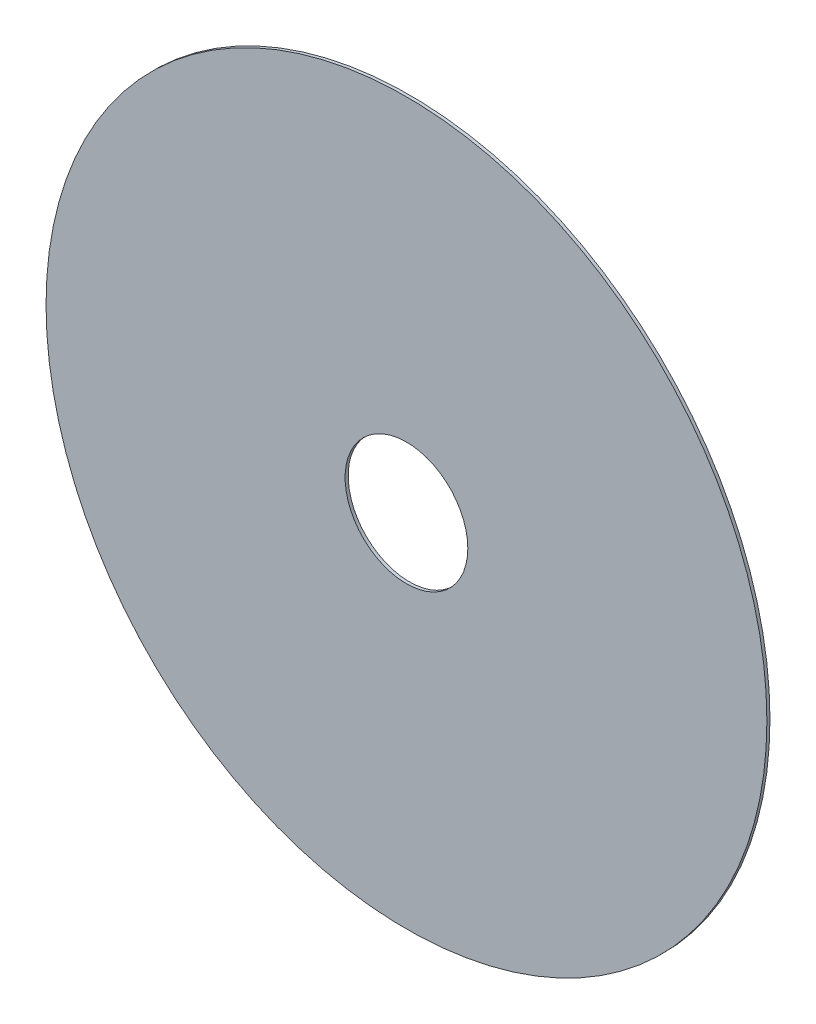
ISO-10303-21;
HEADER;
FILE_DESCRIPTION(('STEP AP214'),'2;1');
FILE_NAME('part.step','',(''),(''),'','','');
FILE_SCHEMA(('AUTOMOTIVE_DESIGN { 1 0 10303 214 1 1 1 1 }'));
ENDSEC;
DATA;
#1=APPLICATION_CONTEXT('core data for automotive mechanical design processes');
#2=APPLICATION_PROTOCOL_DEFINITION('international standard','automotive_design',2000,#1);
#3=PRODUCT_CONTEXT('',#1,'mechanical');
#4=PRODUCT('Part','Part','',(#3));
#5=PRODUCT_RELATED_PRODUCT_CATEGORY('part','',(#4));
#6=PRODUCT_DEFINITION_FORMATION('','',#4);
#7=PRODUCT_DEFINITION_CONTEXT('part definition',#1,'design');
#8=PRODUCT_DEFINITION('design','',#6,#7);
#9=PRODUCT_DEFINITION_SHAPE('','',#8);
#10=(LENGTH_UNIT() NAMED_UNIT(*) SI_UNIT(.MILLI.,.METRE.));
#11=(NAMED_UNIT(*) PLANE_ANGLE_UNIT() SI_UNIT($,.RADIAN.));
#12=(NAMED_UNIT(*) SI_UNIT($,.STERADIAN.) SOLID_ANGLE_UNIT());
#13=UNCERTAINTY_MEASURE_WITH_UNIT(LENGTH_MEASURE(1.E-05),#10,'distance_accuracy_value','');
#14=(GEOMETRIC_REPRESENTATION_CONTEXT(3) GLOBAL_UNCERTAINTY_ASSIGNED_CONTEXT((#13)) GLOBAL_UNIT_ASSIGNED_CONTEXT((#10,
#11,#12)) REPRESENTATION_CONTEXT('',''));
#15=CARTESIAN_POINT('',(0.,0.,0.));
#16=DIRECTION('',(0.,0.,1.));
#17=DIRECTION('',(1.,0.,0.));
#18=AXIS2_PLACEMENT_3D('',#15,#16,#17);
#19=CARTESIAN_POINT('',(0.,0.,0.254));
#20=DIRECTION('',(0.,0.,-1.));
#21=DIRECTION('',(-1.,0.,0.));
#22=AXIS2_PLACEMENT_3D('',#19,#20,#21);
#23=CYLINDRICAL_SURFACE('',#22,29.845);
#24=CARTESIAN_POINT('',(0.,0.,0.254));
#25=DIRECTION('',(0.,0.,1.));
#26=DIRECTION('',(1.,0.,0.));
#27=AXIS2_PLACEMENT_3D('',#24,#25,#26);
#28=CIRCLE('',#27,29.845);
#29=CARTESIAN_POINT('',(29.845,0.,0.254));
#30=VERTEX_POINT('',#29);
#31=EDGE_CURVE('E10',#30,#30,#28,.T.);
#32=ORIENTED_EDGE('',*,*,#31,.F.);
#33=EDGE_LOOP('',(#32));
#34=FACE_BOUND('',#33,.T.);
#35=CARTESIAN_POINT('',(0.,0.,0.));
#36=DIRECTION('',(0.,0.,1.));
#37=DIRECTION('',(1.,0.,0.));
#38=AXIS2_PLACEMENT_3D('',#35,#36,#37);
#39=CIRCLE('',#38,29.845);
#40=CARTESIAN_POINT('',(29.845,0.,0.));
#41=VERTEX_POINT('',#40);
#42=EDGE_CURVE('E40',#41,#41,#39,.T.);
#43=ORIENTED_EDGE('',*,*,#42,.T.);
#44=EDGE_LOOP('',(#43));
#45=FACE_BOUND('',#44,.T.);
#46=ADVANCED_FACE('F37',(#34,#45),#23,.T.);
#47=CARTESIAN_POINT('',(0.,0.,0.254));
#48=DIRECTION('',(0.,0.,1.));
#49=DIRECTION('',(1.,0.,0.));
#50=AXIS2_PLACEMENT_3D('',#47,#48,#49);
#51=PLANE('',#50);
#52=CARTESIAN_POINT('',(0.,0.,0.254));
#53=DIRECTION('',(0.,0.,1.));
#54=DIRECTION('',(1.,0.,0.));
#55=AXIS2_PLACEMENT_3D('',#52,#53,#54);
#56=CIRCLE('',#55,5.08);
#57=CARTESIAN_POINT('',(5.08,0.,0.254));
#58=VERTEX_POINT('',#57);
#59=EDGE_CURVE('E54',#58,#58,#56,.T.);
#60=ORIENTED_EDGE('',*,*,#59,.F.);
#61=EDGE_LOOP('',(#60));
#62=FACE_BOUND('',#61,.T.);
#63=ORIENTED_EDGE('',*,*,#31,.T.);
#64=EDGE_LOOP('',(#63));
#65=FACE_BOUND('',#64,.T.);
#66=ADVANCED_FACE('F61',(#62,#65),#51,.T.);
#67=CARTESIAN_POINT('',(0.,0.,0.));
#68=DIRECTION('',(0.,0.,1.));
#69=DIRECTION('',(1.,0.,0.));
#70=AXIS2_PLACEMENT_3D('',#67,#68,#69);
#71=PLANE('',#70);
#72=CARTESIAN_POINT('',(0.,0.,0.));
#73=DIRECTION('',(0.,0.,1.));
#74=DIRECTION('',(1.,0.,0.));
#75=AXIS2_PLACEMENT_3D('',#72,#73,#74);
#76=CIRCLE('',#75,5.08);
#77=CARTESIAN_POINT('',(5.08,0.,0.));
#78=VERTEX_POINT('',#77);
#79=EDGE_CURVE('E49',#78,#78,#76,.T.);
#80=ORIENTED_EDGE('',*,*,#79,.T.);
#81=EDGE_LOOP('',(#80));
#82=FACE_BOUND('',#81,.T.);
#83=ORIENTED_EDGE('',*,*,#42,.F.);
#84=EDGE_LOOP('',(#83));
#85=FACE_BOUND('',#84,.T.);
#86=ADVANCED_FACE('F63',(#82,#85),#71,.F.);
#87=CARTESIAN_POINT('',(0.,0.,0.254));
#88=DIRECTION('',(0.,0.,1.));
#89=DIRECTION('',(1.,0.,0.));
#90=AXIS2_PLACEMENT_3D('',#87,#88,#89);
#91=CYLINDRICAL_SURFACE('',#90,5.08);
#92=ORIENTED_EDGE('',*,*,#79,.F.);
#93=EDGE_LOOP('',(#92));
#94=FACE_BOUND('',#93,.T.);
#95=ORIENTED_EDGE('',*,*,#59,.T.);
#96=EDGE_LOOP('',(#95));
#97=FACE_BOUND('',#96,.T.);
#98=ADVANCED_FACE('F59',(#94,#97),#91,.F.);
#99=CLOSED_SHELL('',(#46,#66,#86,#98));
#100=MANIFOLD_SOLID_BREP('B2',#99);
#101=ADVANCED_BREP_SHAPE_REPRESENTATION('',(#18,#100),#14);
#102=SHAPE_DEFINITION_REPRESENTATION(#9,#101);
ENDSEC;
END-ISO-10303-21;
